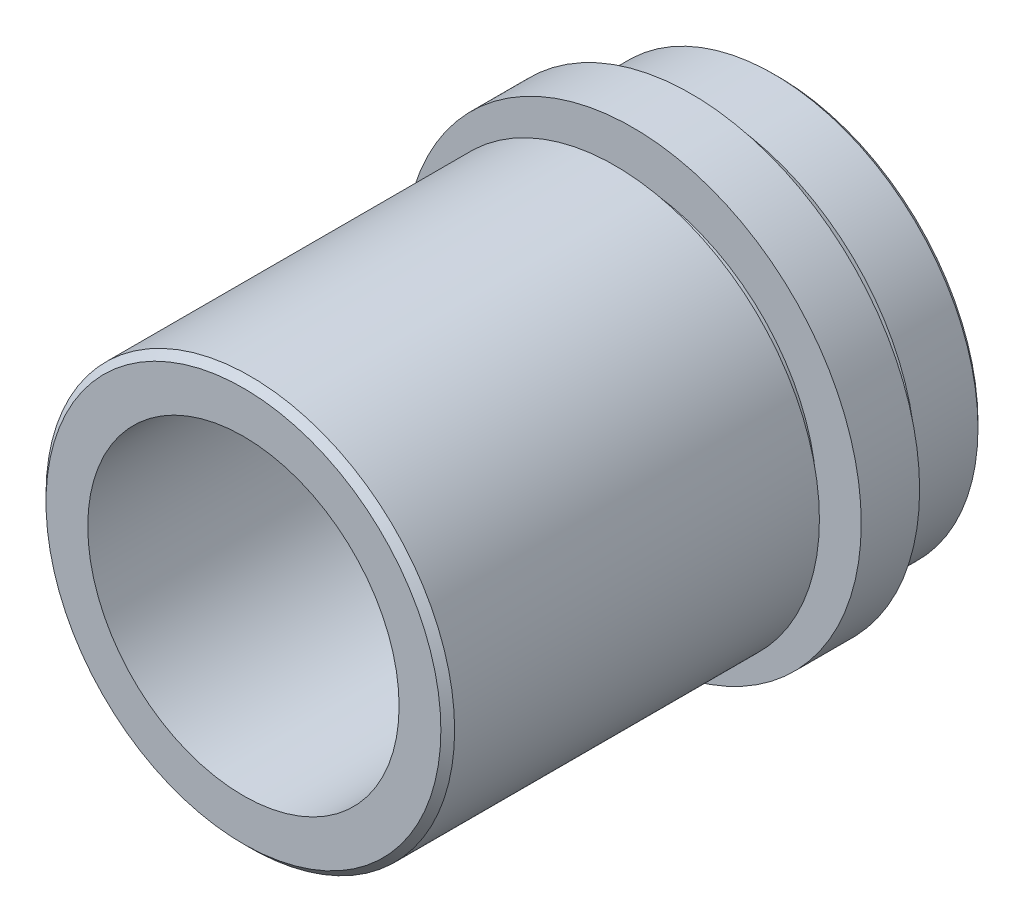
ISO-10303-21;
HEADER;
FILE_DESCRIPTION(('STEP AP214'),'2;1');
FILE_NAME('part.step','',(''),(''),'','','');
FILE_SCHEMA(('AUTOMOTIVE_DESIGN { 1 0 10303 214 1 1 1 1 }'));
ENDSEC;
DATA;
#1=APPLICATION_CONTEXT('core data for automotive mechanical design processes');
#2=APPLICATION_PROTOCOL_DEFINITION('international standard','automotive_design',2000,#1);
#3=PRODUCT_CONTEXT('',#1,'mechanical');
#4=PRODUCT('Part','Part','',(#3));
#5=PRODUCT_RELATED_PRODUCT_CATEGORY('part','',(#4));
#6=PRODUCT_DEFINITION_FORMATION('','',#4);
#7=PRODUCT_DEFINITION_CONTEXT('part definition',#1,'design');
#8=PRODUCT_DEFINITION('design','',#6,#7);
#9=PRODUCT_DEFINITION_SHAPE('','',#8);
#10=(LENGTH_UNIT() NAMED_UNIT(*) SI_UNIT(.MILLI.,.METRE.));
#11=(NAMED_UNIT(*) PLANE_ANGLE_UNIT() SI_UNIT($,.RADIAN.));
#12=(NAMED_UNIT(*) SI_UNIT($,.STERADIAN.) SOLID_ANGLE_UNIT());
#13=UNCERTAINTY_MEASURE_WITH_UNIT(LENGTH_MEASURE(1.E-05),#10,'distance_accuracy_value','');
#14=(GEOMETRIC_REPRESENTATION_CONTEXT(3) GLOBAL_UNCERTAINTY_ASSIGNED_CONTEXT((#13)) GLOBAL_UNIT_ASSIGNED_CONTEXT((#10,
#11,#12)) REPRESENTATION_CONTEXT('',''));
#15=CARTESIAN_POINT('',(0.,0.,0.));
#16=DIRECTION('',(0.,0.,1.));
#17=DIRECTION('',(1.,0.,0.));
#18=AXIS2_PLACEMENT_3D('',#15,#16,#17);
#19=CARTESIAN_POINT('',(0.,0.,0.));
#20=DIRECTION('',(0.,0.,1.));
#21=DIRECTION('',(1.,0.,0.));
#22=AXIS2_PLACEMENT_3D('',#19,#20,#21);
#23=CYLINDRICAL_SURFACE('',#22,21.);
#24=CARTESIAN_POINT('',(0.,0.,0.5));
#25=DIRECTION('',(0.,0.,1.));
#26=DIRECTION('',(1.,0.,0.));
#27=AXIS2_PLACEMENT_3D('',#24,#25,#26);
#28=CIRCLE('',#27,21.);
#29=CARTESIAN_POINT('',(21.,0.,0.5));
#30=VERTEX_POINT('',#29);
#31=EDGE_CURVE('E74',#30,#30,#28,.T.);
#32=ORIENTED_EDGE('',*,*,#31,.T.);
#33=EDGE_LOOP('',(#32));
#34=FACE_BOUND('',#33,.T.);
#35=CARTESIAN_POINT('',(0.,0.,6.9));
#36=DIRECTION('',(0.,0.,1.));
#37=DIRECTION('',(1.,0.,0.));
#38=AXIS2_PLACEMENT_3D('',#35,#36,#37);
#39=CIRCLE('',#38,21.);
#40=CARTESIAN_POINT('',(21.,0.,6.9));
#41=VERTEX_POINT('',#40);
#42=EDGE_CURVE('E83',#41,#41,#39,.T.);
#43=ORIENTED_EDGE('',*,*,#42,.F.);
#44=EDGE_LOOP('',(#43));
#45=FACE_BOUND('',#44,.T.);
#46=ADVANCED_FACE('F33',(#34,#45),#23,.T.);
#47=CARTESIAN_POINT('',(0.,21.,0.));
#48=DIRECTION('',(0.,0.,1.));
#49=DIRECTION('',(1.,0.,0.));
#50=AXIS2_PLACEMENT_3D('',#47,#48,#49);
#51=PLANE('',#50);
#52=CARTESIAN_POINT('',(0.,0.,0.));
#53=DIRECTION('',(0.,0.,1.));
#54=DIRECTION('',(1.,0.,0.));
#55=AXIS2_PLACEMENT_3D('',#52,#53,#54);
#56=CIRCLE('',#55,17.);
#57=CARTESIAN_POINT('',(17.,0.,0.));
#58=VERTEX_POINT('',#57);
#59=EDGE_CURVE('E68',#58,#58,#56,.T.);
#60=ORIENTED_EDGE('',*,*,#59,.T.);
#61=EDGE_LOOP('',(#60));
#62=FACE_BOUND('',#61,.T.);
#63=CARTESIAN_POINT('',(0.,0.,0.));
#64=DIRECTION('',(0.,0.,1.));
#65=DIRECTION('',(1.,0.,0.));
#66=AXIS2_PLACEMENT_3D('',#63,#64,#65);
#67=CIRCLE('',#66,20.5);
#68=CARTESIAN_POINT('',(20.5,0.,0.));
#69=VERTEX_POINT('',#68);
#70=EDGE_CURVE('E71',#69,#69,#67,.T.);
#71=ORIENTED_EDGE('',*,*,#70,.F.);
#72=EDGE_LOOP('',(#71));
#73=FACE_BOUND('',#72,.T.);
#74=ADVANCED_FACE('F91',(#62,#73),#51,.F.);
#75=CARTESIAN_POINT('',(0.,0.,55.));
#76=DIRECTION('',(0.,0.,-1.));
#77=DIRECTION('',(-1.,0.,0.));
#78=AXIS2_PLACEMENT_3D('',#75,#76,#77);
#79=PLANE('',#78);
#80=CARTESIAN_POINT('',(0.,0.,55.));
#81=DIRECTION('',(0.,0.,1.));
#82=DIRECTION('',(1.,0.,0.));
#83=AXIS2_PLACEMENT_3D('',#80,#81,#82);
#84=CIRCLE('',#83,20.2928932188134);
#85=CARTESIAN_POINT('',(20.2928932188134,0.,55.));
#86=VERTEX_POINT('',#85);
#87=EDGE_CURVE('E48',#86,#86,#84,.T.);
#88=ORIENTED_EDGE('',*,*,#87,.T.);
#89=EDGE_LOOP('',(#88));
#90=FACE_BOUND('',#89,.T.);
#91=CARTESIAN_POINT('',(0.,0.,55.));
#92=DIRECTION('',(0.,0.,1.));
#93=DIRECTION('',(1.,0.,0.));
#94=AXIS2_PLACEMENT_3D('',#91,#92,#93);
#95=CIRCLE('',#94,16.);
#96=CARTESIAN_POINT('',(16.,0.,55.));
#97=VERTEX_POINT('',#96);
#98=EDGE_CURVE('E62',#97,#97,#95,.T.);
#99=ORIENTED_EDGE('',*,*,#98,.F.);
#100=EDGE_LOOP('',(#99));
#101=FACE_BOUND('',#100,.T.);
#102=ADVANCED_FACE('F97',(#90,#101),#79,.F.);
#103=CARTESIAN_POINT('',(0.,23.5,9.));
#104=DIRECTION('',(0.,0.,1.));
#105=DIRECTION('',(1.,0.,0.));
#106=AXIS2_PLACEMENT_3D('',#103,#104,#105);
#107=PLANE('',#106);
#108=CARTESIAN_POINT('',(0.,0.,9.));
#109=DIRECTION('',(0.,0.,1.));
#110=DIRECTION('',(1.,0.,0.));
#111=AXIS2_PLACEMENT_3D('',#108,#109,#110);
#112=CIRCLE('',#111,23.5);
#113=CARTESIAN_POINT('',(23.5,0.,9.));
#114=VERTEX_POINT('',#113);
#115=EDGE_CURVE('E40',#114,#114,#112,.T.);
#116=ORIENTED_EDGE('',*,*,#115,.F.);
#117=EDGE_LOOP('',(#116));
#118=FACE_BOUND('',#117,.T.);
#119=CARTESIAN_POINT('',(0.,0.,9.));
#120=DIRECTION('',(0.,0.,1.));
#121=DIRECTION('',(1.,0.,0.));
#122=AXIS2_PLACEMENT_3D('',#119,#120,#121);
#123=CIRCLE('',#122,18.9);
#124=CARTESIAN_POINT('',(18.9,0.,9.));
#125=VERTEX_POINT('',#124);
#126=EDGE_CURVE('E77',#125,#125,#123,.T.);
#127=ORIENTED_EDGE('',*,*,#126,.T.);
#128=EDGE_LOOP('',(#127));
#129=FACE_BOUND('',#128,.T.);
#130=ADVANCED_FACE('F118',(#118,#129),#107,.F.);
#131=CARTESIAN_POINT('',(0.,0.,15.));
#132=DIRECTION('',(0.,0.,1.));
#133=DIRECTION('',(1.,0.,0.));
#134=AXIS2_PLACEMENT_3D('',#131,#132,#133);
#135=CYLINDRICAL_SURFACE('',#134,21.);
#136=CARTESIAN_POINT('',(0.,0.,54.2928932188135));
#137=DIRECTION('',(0.,0.,1.));
#138=DIRECTION('',(1.,0.,0.));
#139=AXIS2_PLACEMENT_3D('',#136,#137,#138);
#140=CIRCLE('',#139,21.);
#141=CARTESIAN_POINT('',(21.,0.,54.2928932188135));
#142=VERTEX_POINT('',#141);
#143=EDGE_CURVE('E44',#142,#142,#140,.T.);
#144=ORIENTED_EDGE('',*,*,#143,.F.);
#145=EDGE_LOOP('',(#144));
#146=FACE_BOUND('',#145,.T.);
#147=CARTESIAN_POINT('',(0.,0.,16.8));
#148=DIRECTION('',(0.,0.,1.));
#149=DIRECTION('',(1.,0.,0.));
#150=AXIS2_PLACEMENT_3D('',#147,#148,#149);
#151=CIRCLE('',#150,21.);
#152=CARTESIAN_POINT('',(21.,0.,16.8));
#153=VERTEX_POINT('',#152);
#154=EDGE_CURVE('E53',#153,#153,#151,.T.);
#155=ORIENTED_EDGE('',*,*,#154,.T.);
#156=EDGE_LOOP('',(#155));
#157=FACE_BOUND('',#156,.T.);
#158=ADVANCED_FACE('F114',(#146,#157),#135,.T.);
#159=CARTESIAN_POINT('',(0.,0.,55.));
#160=DIRECTION('',(0.,0.,-1.));
#161=DIRECTION('',(-1.,0.,0.));
#162=AXIS2_PLACEMENT_3D('',#159,#160,#161);
#163=CONICAL_SURFACE('',#162,20.2928932188134,0.785398163397463);
#164=ORIENTED_EDGE('',*,*,#143,.T.);
#165=EDGE_LOOP('',(#164));
#166=FACE_BOUND('',#165,.T.);
#167=ORIENTED_EDGE('',*,*,#87,.F.);
#168=EDGE_LOOP('',(#167));
#169=FACE_BOUND('',#168,.T.);
#170=ADVANCED_FACE('F110',(#166,#169),#163,.T.);
#171=CARTESIAN_POINT('',(0.,21.,16.8));
#172=DIRECTION('',(0.,0.,-1.));
#173=DIRECTION('',(-1.,0.,0.));
#174=AXIS2_PLACEMENT_3D('',#171,#172,#173);
#175=PLANE('',#174);
#176=CARTESIAN_POINT('',(0.,0.,16.8));
#177=DIRECTION('',(0.,0.,1.));
#178=DIRECTION('',(1.,0.,0.));
#179=AXIS2_PLACEMENT_3D('',#176,#177,#178);
#180=CIRCLE('',#179,18.9);
#181=CARTESIAN_POINT('',(18.9,0.,16.8));
#182=VERTEX_POINT('',#181);
#183=EDGE_CURVE('E56',#182,#182,#180,.T.);
#184=ORIENTED_EDGE('',*,*,#183,.T.);
#185=EDGE_LOOP('',(#184));
#186=FACE_BOUND('',#185,.T.);
#187=ORIENTED_EDGE('',*,*,#154,.F.);
#188=EDGE_LOOP('',(#187));
#189=FACE_BOUND('',#188,.T.);
#190=ADVANCED_FACE('F106',(#186,#189),#175,.T.);
#191=CARTESIAN_POINT('',(0.,0.,15.));
#192=DIRECTION('',(0.,0.,1.));
#193=DIRECTION('',(1.,0.,0.));
#194=AXIS2_PLACEMENT_3D('',#191,#192,#193);
#195=CYLINDRICAL_SURFACE('',#194,18.9);
#196=CARTESIAN_POINT('',(0.,0.,15.));
#197=DIRECTION('',(0.,0.,1.));
#198=DIRECTION('',(1.,0.,0.));
#199=AXIS2_PLACEMENT_3D('',#196,#197,#198);
#200=CIRCLE('',#199,18.9);
#201=CARTESIAN_POINT('',(18.9,0.,15.));
#202=VERTEX_POINT('',#201);
#203=EDGE_CURVE('E59',#202,#202,#200,.T.);
#204=ORIENTED_EDGE('',*,*,#203,.T.);
#205=EDGE_LOOP('',(#204));
#206=FACE_BOUND('',#205,.T.);
#207=ORIENTED_EDGE('',*,*,#183,.F.);
#208=EDGE_LOOP('',(#207));
#209=FACE_BOUND('',#208,.T.);
#210=ADVANCED_FACE('F102',(#206,#209),#195,.T.);
#211=CARTESIAN_POINT('',(0.,0.,9.));
#212=DIRECTION('',(0.,0.,1.));
#213=DIRECTION('',(1.,0.,0.));
#214=AXIS2_PLACEMENT_3D('',#211,#212,#213);
#215=CYLINDRICAL_SURFACE('',#214,23.5);
#216=CARTESIAN_POINT('',(0.,0.,15.));
#217=DIRECTION('',(0.,0.,1.));
#218=DIRECTION('',(1.,0.,0.));
#219=AXIS2_PLACEMENT_3D('',#216,#217,#218);
#220=CIRCLE('',#219,23.5);
#221=CARTESIAN_POINT('',(23.5,0.,15.));
#222=VERTEX_POINT('',#221);
#223=EDGE_CURVE('E10',#222,#222,#220,.T.);
#224=ORIENTED_EDGE('',*,*,#223,.F.);
#225=EDGE_LOOP('',(#224));
#226=FACE_BOUND('',#225,.T.);
#227=ORIENTED_EDGE('',*,*,#115,.T.);
#228=EDGE_LOOP('',(#227));
#229=FACE_BOUND('',#228,.T.);
#230=ADVANCED_FACE('F105',(#226,#229),#215,.T.);
#231=CARTESIAN_POINT('',(0.,0.,15.));
#232=DIRECTION('',(0.,0.,-1.));
#233=DIRECTION('',(-1.,0.,0.));
#234=AXIS2_PLACEMENT_3D('',#231,#232,#233);
#235=PLANE('',#234);
#236=ORIENTED_EDGE('',*,*,#223,.T.);
#237=EDGE_LOOP('',(#236));
#238=FACE_BOUND('',#237,.T.);
#239=ORIENTED_EDGE('',*,*,#203,.F.);
#240=EDGE_LOOP('',(#239));
#241=FACE_BOUND('',#240,.T.);
#242=ADVANCED_FACE('F35',(#238,#241),#235,.F.);
#243=CARTESIAN_POINT('',(0.,0.,0.));
#244=DIRECTION('',(0.,0.,1.));
#245=DIRECTION('',(1.,0.,0.));
#246=AXIS2_PLACEMENT_3D('',#243,#244,#245);
#247=CYLINDRICAL_SURFACE('',#246,16.);
#248=ORIENTED_EDGE('',*,*,#98,.T.);
#249=EDGE_LOOP('',(#248));
#250=FACE_BOUND('',#249,.T.);
#251=CARTESIAN_POINT('',(0.,0.,1.));
#252=DIRECTION('',(0.,0.,1.));
#253=DIRECTION('',(1.,0.,0.));
#254=AXIS2_PLACEMENT_3D('',#251,#252,#253);
#255=CIRCLE('',#254,16.);
#256=CARTESIAN_POINT('',(16.,0.,1.));
#257=VERTEX_POINT('',#256);
#258=EDGE_CURVE('E65',#257,#257,#255,.T.);
#259=ORIENTED_EDGE('',*,*,#258,.F.);
#260=EDGE_LOOP('',(#259));
#261=FACE_BOUND('',#260,.T.);
#262=ADVANCED_FACE('F130',(#250,#261),#247,.F.);
#263=CARTESIAN_POINT('',(0.,0.,0.));
#264=DIRECTION('',(0.,0.,-1.));
#265=DIRECTION('',(-1.,0.,0.));
#266=AXIS2_PLACEMENT_3D('',#263,#264,#265);
#267=CONICAL_SURFACE('',#266,17.,0.785398163397449);
#268=ORIENTED_EDGE('',*,*,#258,.T.);
#269=EDGE_LOOP('',(#268));
#270=FACE_BOUND('',#269,.T.);
#271=ORIENTED_EDGE('',*,*,#59,.F.);
#272=EDGE_LOOP('',(#271));
#273=FACE_BOUND('',#272,.T.);
#274=ADVANCED_FACE('F134',(#270,#273),#267,.F.);
#275=CARTESIAN_POINT('',(0.,0.,0.5));
#276=DIRECTION('',(0.,0.,1.));
#277=DIRECTION('',(1.,0.,0.));
#278=AXIS2_PLACEMENT_3D('',#275,#276,#277);
#279=CONICAL_SURFACE('',#278,21.,0.785398163397449);
#280=ORIENTED_EDGE('',*,*,#70,.T.);
#281=EDGE_LOOP('',(#280));
#282=FACE_BOUND('',#281,.T.);
#283=ORIENTED_EDGE('',*,*,#31,.F.);
#284=EDGE_LOOP('',(#283));
#285=FACE_BOUND('',#284,.T.);
#286=ADVANCED_FACE('F146',(#282,#285),#279,.T.);
#287=CARTESIAN_POINT('',(0.,0.,0.));
#288=DIRECTION('',(0.,0.,1.));
#289=DIRECTION('',(1.,0.,0.));
#290=AXIS2_PLACEMENT_3D('',#287,#288,#289);
#291=CYLINDRICAL_SURFACE('',#290,18.9);
#292=CARTESIAN_POINT('',(0.,0.,6.9));
#293=DIRECTION('',(0.,0.,1.));
#294=DIRECTION('',(1.,0.,0.));
#295=AXIS2_PLACEMENT_3D('',#292,#293,#294);
#296=CIRCLE('',#295,18.9);
#297=CARTESIAN_POINT('',(18.9,0.,6.9));
#298=VERTEX_POINT('',#297);
#299=EDGE_CURVE('E80',#298,#298,#296,.T.);
#300=ORIENTED_EDGE('',*,*,#299,.T.);
#301=EDGE_LOOP('',(#300));
#302=FACE_BOUND('',#301,.T.);
#303=ORIENTED_EDGE('',*,*,#126,.F.);
#304=EDGE_LOOP('',(#303));
#305=FACE_BOUND('',#304,.T.);
#306=ADVANCED_FACE('F153',(#302,#305),#291,.T.);
#307=CARTESIAN_POINT('',(0.,18.9,6.9));
#308=DIRECTION('',(0.,0.,1.));
#309=DIRECTION('',(1.,0.,0.));
#310=AXIS2_PLACEMENT_3D('',#307,#308,#309);
#311=PLANE('',#310);
#312=ORIENTED_EDGE('',*,*,#42,.T.);
#313=EDGE_LOOP('',(#312));
#314=FACE_BOUND('',#313,.T.);
#315=ORIENTED_EDGE('',*,*,#299,.F.);
#316=EDGE_LOOP('',(#315));
#317=FACE_BOUND('',#316,.T.);
#318=ADVANCED_FACE('F87',(#314,#317),#311,.T.);
#319=CLOSED_SHELL('',(#46,#74,#102,#130,#158,#170,#190,#210,#230,#242,#262,#274,#286,#306,#318));
#320=MANIFOLD_SOLID_BREP('B2',#319);
#321=ADVANCED_BREP_SHAPE_REPRESENTATION('',(#18,#320),#14);
#322=SHAPE_DEFINITION_REPRESENTATION(#9,#321);
ENDSEC;
END-ISO-10303-21;
